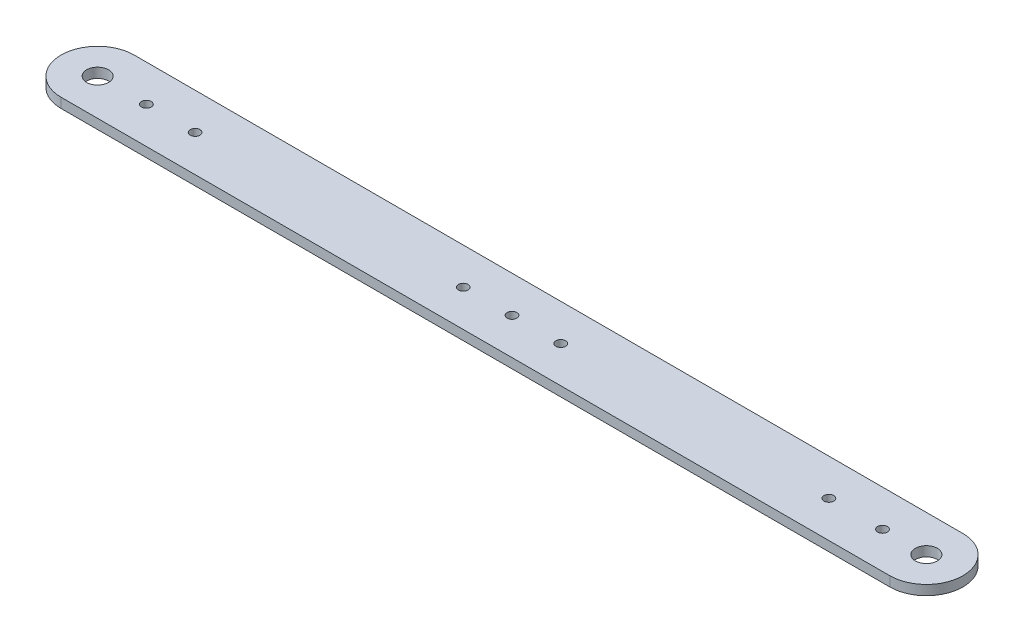
ISO-10303-21;
HEADER;
FILE_DESCRIPTION(('STEP AP214'),'2;1');
FILE_NAME('part.step','',(''),(''),'','','');
FILE_SCHEMA(('AUTOMOTIVE_DESIGN { 1 0 10303 214 1 1 1 1 }'));
ENDSEC;
DATA;
#1=APPLICATION_CONTEXT('core data for automotive mechanical design processes');
#2=APPLICATION_PROTOCOL_DEFINITION('international standard','automotive_design',2000,#1);
#3=PRODUCT_CONTEXT('',#1,'mechanical');
#4=PRODUCT('Part','Part','',(#3));
#5=PRODUCT_RELATED_PRODUCT_CATEGORY('part','',(#4));
#6=PRODUCT_DEFINITION_FORMATION('','',#4);
#7=PRODUCT_DEFINITION_CONTEXT('part definition',#1,'design');
#8=PRODUCT_DEFINITION('design','',#6,#7);
#9=PRODUCT_DEFINITION_SHAPE('','',#8);
#10=(LENGTH_UNIT() NAMED_UNIT(*) SI_UNIT(.MILLI.,.METRE.));
#11=(NAMED_UNIT(*) PLANE_ANGLE_UNIT() SI_UNIT($,.RADIAN.));
#12=(NAMED_UNIT(*) SI_UNIT($,.STERADIAN.) SOLID_ANGLE_UNIT());
#13=UNCERTAINTY_MEASURE_WITH_UNIT(LENGTH_MEASURE(1.E-05),#10,'distance_accuracy_value','');
#14=(GEOMETRIC_REPRESENTATION_CONTEXT(3) GLOBAL_UNCERTAINTY_ASSIGNED_CONTEXT((#13)) GLOBAL_UNIT_ASSIGNED_CONTEXT((#10,
#11,#12)) REPRESENTATION_CONTEXT('',''));
#15=CARTESIAN_POINT('',(0.,0.,0.));
#16=DIRECTION('',(0.,0.,1.));
#17=DIRECTION('',(1.,0.,0.));
#18=AXIS2_PLACEMENT_3D('',#15,#16,#17);
#19=CARTESIAN_POINT('',(-170.,4.,0.));
#20=DIRECTION('',(0.,-1.,0.));
#21=DIRECTION('',(0.,0.,-1.));
#22=AXIS2_PLACEMENT_3D('',#19,#20,#21);
#23=PLANE('',#22);
#24=CARTESIAN_POINT('',(-170.,4.,0.));
#25=DIRECTION('',(0.,1.,0.));
#26=DIRECTION('',(0.,0.,-1.));
#27=AXIS2_PLACEMENT_3D('',#24,#25,#26);
#28=CIRCLE('',#27,15.);
#29=CARTESIAN_POINT('',(-170.,4.,-15.));
#30=VERTEX_POINT('',#29);
#31=CARTESIAN_POINT('',(-170.,4.,15.0000000000001));
#32=VERTEX_POINT('',#31);
#33=EDGE_CURVE('E84',#30,#32,#28,.T.);
#34=ORIENTED_EDGE('',*,*,#33,.T.);
#35=DIRECTION('',(1.,0.,0.));
#36=VECTOR('',#35,1.);
#37=CARTESIAN_POINT('',(170.,4.,15.));
#38=LINE('',#37,#36);
#39=CARTESIAN_POINT('',(170.,4.,15.));
#40=VERTEX_POINT('',#39);
#41=EDGE_CURVE('E79',#32,#40,#38,.T.);
#42=ORIENTED_EDGE('',*,*,#41,.T.);
#43=CARTESIAN_POINT('',(170.,4.,0.));
#44=DIRECTION('',(0.,1.,0.));
#45=DIRECTION('',(0.,0.,-1.));
#46=AXIS2_PLACEMENT_3D('',#43,#44,#45);
#47=CIRCLE('',#46,15.);
#48=CARTESIAN_POINT('',(170.,4.,-15.));
#49=VERTEX_POINT('',#48);
#50=EDGE_CURVE('E82',#40,#49,#47,.T.);
#51=ORIENTED_EDGE('',*,*,#50,.T.);
#52=DIRECTION('',(-1.,0.,0.));
#53=VECTOR('',#52,1.);
#54=CARTESIAN_POINT('',(-170.,4.,-15.));
#55=LINE('',#54,#53);
#56=EDGE_CURVE('E49',#49,#30,#55,.T.);
#57=ORIENTED_EDGE('',*,*,#56,.T.);
#58=EDGE_LOOP('',(#34,#42,#51,#57));
#59=FACE_BOUND('',#58,.T.);
#60=CARTESIAN_POINT('',(-170.,4.,0.));
#61=DIRECTION('',(0.,1.,0.));
#62=DIRECTION('',(0.,0.,1.));
#63=AXIS2_PLACEMENT_3D('',#60,#61,#62);
#64=CIRCLE('',#63,4.50000000000002);
#65=CARTESIAN_POINT('',(-170.,4.,4.50000000000004));
#66=VERTEX_POINT('',#65);
#67=EDGE_CURVE('E99',#66,#66,#64,.T.);
#68=ORIENTED_EDGE('',*,*,#67,.F.);
#69=EDGE_LOOP('',(#68));
#70=FACE_BOUND('',#69,.T.);
#71=CARTESIAN_POINT('',(152.,4.,0.));
#72=DIRECTION('',(0.,1.,0.));
#73=DIRECTION('',(0.,0.,1.));
#74=AXIS2_PLACEMENT_3D('',#71,#72,#73);
#75=CIRCLE('',#74,2.);
#76=CARTESIAN_POINT('',(152.,4.,2.));
#77=VERTEX_POINT('',#76);
#78=EDGE_CURVE('E114',#77,#77,#75,.T.);
#79=ORIENTED_EDGE('',*,*,#78,.F.);
#80=EDGE_LOOP('',(#79));
#81=FACE_BOUND('',#80,.T.);
#82=CARTESIAN_POINT('',(170.,4.,0.));
#83=DIRECTION('',(0.,1.,0.));
#84=DIRECTION('',(0.,0.,1.));
#85=AXIS2_PLACEMENT_3D('',#82,#83,#84);
#86=CIRCLE('',#85,4.49999999999999);
#87=CARTESIAN_POINT('',(170.,4.,4.49999999999999));
#88=VERTEX_POINT('',#87);
#89=EDGE_CURVE('E120',#88,#88,#86,.T.);
#90=ORIENTED_EDGE('',*,*,#89,.F.);
#91=EDGE_LOOP('',(#90));
#92=FACE_BOUND('',#91,.T.);
#93=CARTESIAN_POINT('',(0.,4.,0.));
#94=DIRECTION('',(0.,1.,0.));
#95=DIRECTION('',(0.,0.,1.));
#96=AXIS2_PLACEMENT_3D('',#93,#94,#95);
#97=CIRCLE('',#96,2.);
#98=CARTESIAN_POINT('',(0.,4.,2.));
#99=VERTEX_POINT('',#98);
#100=EDGE_CURVE('E126',#99,#99,#97,.T.);
#101=ORIENTED_EDGE('',*,*,#100,.F.);
#102=EDGE_LOOP('',(#101));
#103=FACE_BOUND('',#102,.T.);
#104=CARTESIAN_POINT('',(-150.,4.,0.));
#105=DIRECTION('',(0.,1.,0.));
#106=DIRECTION('',(0.,0.,1.));
#107=AXIS2_PLACEMENT_3D('',#104,#105,#106);
#108=CIRCLE('',#107,2.);
#109=CARTESIAN_POINT('',(-150.,4.,2.00000000000001));
#110=VERTEX_POINT('',#109);
#111=EDGE_CURVE('E132',#110,#110,#108,.T.);
#112=ORIENTED_EDGE('',*,*,#111,.F.);
#113=EDGE_LOOP('',(#112));
#114=FACE_BOUND('',#113,.T.);
#115=CARTESIAN_POINT('',(-130.,4.,0.));
#116=DIRECTION('',(0.,1.,0.));
#117=DIRECTION('',(0.,0.,1.));
#118=AXIS2_PLACEMENT_3D('',#115,#116,#117);
#119=CIRCLE('',#118,2.);
#120=CARTESIAN_POINT('',(-130.,4.,2.00000000000001));
#121=VERTEX_POINT('',#120);
#122=EDGE_CURVE('E138',#121,#121,#119,.T.);
#123=ORIENTED_EDGE('',*,*,#122,.F.);
#124=EDGE_LOOP('',(#123));
#125=FACE_BOUND('',#124,.T.);
#126=CARTESIAN_POINT('',(-20.,4.,0.));
#127=DIRECTION('',(0.,1.,0.));
#128=DIRECTION('',(0.,0.,1.));
#129=AXIS2_PLACEMENT_3D('',#126,#127,#128);
#130=CIRCLE('',#129,2.);
#131=CARTESIAN_POINT('',(-20.,4.,2.));
#132=VERTEX_POINT('',#131);
#133=EDGE_CURVE('E144',#132,#132,#130,.T.);
#134=ORIENTED_EDGE('',*,*,#133,.F.);
#135=EDGE_LOOP('',(#134));
#136=FACE_BOUND('',#135,.T.);
#137=CARTESIAN_POINT('',(20.,4.,0.));
#138=DIRECTION('',(0.,1.,0.));
#139=DIRECTION('',(0.,0.,-1.));
#140=AXIS2_PLACEMENT_3D('',#137,#138,#139);
#141=CIRCLE('',#140,2.);
#142=CARTESIAN_POINT('',(20.,4.,-2.));
#143=VERTEX_POINT('',#142);
#144=EDGE_CURVE('E150',#143,#143,#141,.T.);
#145=ORIENTED_EDGE('',*,*,#144,.F.);
#146=EDGE_LOOP('',(#145));
#147=FACE_BOUND('',#146,.T.);
#148=CARTESIAN_POINT('',(130.,4.,0.));
#149=DIRECTION('',(0.,1.,0.));
#150=DIRECTION('',(0.,0.,-1.));
#151=AXIS2_PLACEMENT_3D('',#148,#149,#150);
#152=CIRCLE('',#151,2.);
#153=CARTESIAN_POINT('',(130.,4.,-1.99999999999998));
#154=VERTEX_POINT('',#153);
#155=EDGE_CURVE('E156',#154,#154,#152,.T.);
#156=ORIENTED_EDGE('',*,*,#155,.F.);
#157=EDGE_LOOP('',(#156));
#158=FACE_BOUND('',#157,.T.);
#159=ADVANCED_FACE('F32',(#59,#70,#81,#92,#103,#114,#125,#136,#147,#158),#23,.F.);
#160=CARTESIAN_POINT('',(-170.,0.,0.));
#161=DIRECTION('',(0.,-1.,0.));
#162=DIRECTION('',(0.,0.,-1.));
#163=AXIS2_PLACEMENT_3D('',#160,#161,#162);
#164=PLANE('',#163);
#165=CARTESIAN_POINT('',(20.,0.,0.));
#166=DIRECTION('',(0.,1.,0.));
#167=DIRECTION('',(0.,0.,-1.));
#168=AXIS2_PLACEMENT_3D('',#165,#166,#167);
#169=CIRCLE('',#168,2.);
#170=CARTESIAN_POINT('',(20.,0.,-2.));
#171=VERTEX_POINT('',#170);
#172=EDGE_CURVE('E153',#171,#171,#169,.T.);
#173=ORIENTED_EDGE('',*,*,#172,.T.);
#174=EDGE_LOOP('',(#173));
#175=FACE_BOUND('',#174,.T.);
#176=CARTESIAN_POINT('',(-130.,0.,0.));
#177=DIRECTION('',(0.,1.,0.));
#178=DIRECTION('',(0.,0.,1.));
#179=AXIS2_PLACEMENT_3D('',#176,#177,#178);
#180=CIRCLE('',#179,2.);
#181=CARTESIAN_POINT('',(-130.,0.,2.00000000000001));
#182=VERTEX_POINT('',#181);
#183=EDGE_CURVE('E141',#182,#182,#180,.T.);
#184=ORIENTED_EDGE('',*,*,#183,.T.);
#185=EDGE_LOOP('',(#184));
#186=FACE_BOUND('',#185,.T.);
#187=CARTESIAN_POINT('',(0.,0.,0.));
#188=DIRECTION('',(0.,1.,0.));
#189=DIRECTION('',(0.,0.,1.));
#190=AXIS2_PLACEMENT_3D('',#187,#188,#189);
#191=CIRCLE('',#190,2.);
#192=CARTESIAN_POINT('',(0.,0.,2.));
#193=VERTEX_POINT('',#192);
#194=EDGE_CURVE('E129',#193,#193,#191,.T.);
#195=ORIENTED_EDGE('',*,*,#194,.T.);
#196=EDGE_LOOP('',(#195));
#197=FACE_BOUND('',#196,.T.);
#198=CARTESIAN_POINT('',(152.,0.,0.));
#199=DIRECTION('',(0.,1.,0.));
#200=DIRECTION('',(0.,0.,1.));
#201=AXIS2_PLACEMENT_3D('',#198,#199,#200);
#202=CIRCLE('',#201,2.);
#203=CARTESIAN_POINT('',(152.,0.,2.));
#204=VERTEX_POINT('',#203);
#205=EDGE_CURVE('E117',#204,#204,#202,.T.);
#206=ORIENTED_EDGE('',*,*,#205,.T.);
#207=EDGE_LOOP('',(#206));
#208=FACE_BOUND('',#207,.T.);
#209=CARTESIAN_POINT('',(-170.,0.,0.));
#210=DIRECTION('',(0.,1.,0.));
#211=DIRECTION('',(0.,0.,-1.));
#212=AXIS2_PLACEMENT_3D('',#209,#210,#211);
#213=CIRCLE('',#212,15.);
#214=CARTESIAN_POINT('',(-170.,0.,-15.));
#215=VERTEX_POINT('',#214);
#216=CARTESIAN_POINT('',(-170.,0.,15.0000000000001));
#217=VERTEX_POINT('',#216);
#218=EDGE_CURVE('E96',#215,#217,#213,.T.);
#219=ORIENTED_EDGE('',*,*,#218,.F.);
#220=DIRECTION('',(-1.,0.,0.));
#221=VECTOR('',#220,1.);
#222=CARTESIAN_POINT('',(-170.,0.,-15.));
#223=LINE('',#222,#221);
#224=CARTESIAN_POINT('',(170.,0.,-15.));
#225=VERTEX_POINT('',#224);
#226=EDGE_CURVE('E72',#225,#215,#223,.T.);
#227=ORIENTED_EDGE('',*,*,#226,.F.);
#228=CARTESIAN_POINT('',(170.,0.,0.));
#229=DIRECTION('',(0.,1.,0.));
#230=DIRECTION('',(0.,0.,-1.));
#231=AXIS2_PLACEMENT_3D('',#228,#229,#230);
#232=CIRCLE('',#231,15.);
#233=CARTESIAN_POINT('',(170.,0.,15.));
#234=VERTEX_POINT('',#233);
#235=EDGE_CURVE('E66',#234,#225,#232,.T.);
#236=ORIENTED_EDGE('',*,*,#235,.F.);
#237=DIRECTION('',(1.,0.,0.));
#238=VECTOR('',#237,1.);
#239=CARTESIAN_POINT('',(170.,0.,15.));
#240=LINE('',#239,#238);
#241=EDGE_CURVE('E88',#217,#234,#240,.T.);
#242=ORIENTED_EDGE('',*,*,#241,.F.);
#243=EDGE_LOOP('',(#219,#227,#236,#242));
#244=FACE_BOUND('',#243,.T.);
#245=CARTESIAN_POINT('',(-170.,0.,0.));
#246=DIRECTION('',(0.,1.,0.));
#247=DIRECTION('',(0.,0.,1.));
#248=AXIS2_PLACEMENT_3D('',#245,#246,#247);
#249=CIRCLE('',#248,4.50000000000002);
#250=CARTESIAN_POINT('',(-170.,0.,4.50000000000004));
#251=VERTEX_POINT('',#250);
#252=EDGE_CURVE('E111',#251,#251,#249,.T.);
#253=ORIENTED_EDGE('',*,*,#252,.T.);
#254=EDGE_LOOP('',(#253));
#255=FACE_BOUND('',#254,.T.);
#256=CARTESIAN_POINT('',(170.,0.,0.));
#257=DIRECTION('',(0.,1.,0.));
#258=DIRECTION('',(0.,0.,1.));
#259=AXIS2_PLACEMENT_3D('',#256,#257,#258);
#260=CIRCLE('',#259,4.49999999999999);
#261=CARTESIAN_POINT('',(170.,0.,4.49999999999999));
#262=VERTEX_POINT('',#261);
#263=EDGE_CURVE('E123',#262,#262,#260,.T.);
#264=ORIENTED_EDGE('',*,*,#263,.T.);
#265=EDGE_LOOP('',(#264));
#266=FACE_BOUND('',#265,.T.);
#267=CARTESIAN_POINT('',(-150.,0.,0.));
#268=DIRECTION('',(0.,1.,0.));
#269=DIRECTION('',(0.,0.,1.));
#270=AXIS2_PLACEMENT_3D('',#267,#268,#269);
#271=CIRCLE('',#270,2.);
#272=CARTESIAN_POINT('',(-150.,0.,2.00000000000001));
#273=VERTEX_POINT('',#272);
#274=EDGE_CURVE('E135',#273,#273,#271,.T.);
#275=ORIENTED_EDGE('',*,*,#274,.T.);
#276=EDGE_LOOP('',(#275));
#277=FACE_BOUND('',#276,.T.);
#278=CARTESIAN_POINT('',(-20.,0.,0.));
#279=DIRECTION('',(0.,1.,0.));
#280=DIRECTION('',(0.,0.,1.));
#281=AXIS2_PLACEMENT_3D('',#278,#279,#280);
#282=CIRCLE('',#281,2.);
#283=CARTESIAN_POINT('',(-20.,0.,2.));
#284=VERTEX_POINT('',#283);
#285=EDGE_CURVE('E147',#284,#284,#282,.T.);
#286=ORIENTED_EDGE('',*,*,#285,.T.);
#287=EDGE_LOOP('',(#286));
#288=FACE_BOUND('',#287,.T.);
#289=CARTESIAN_POINT('',(130.,0.,0.));
#290=DIRECTION('',(0.,1.,0.));
#291=DIRECTION('',(0.,0.,-1.));
#292=AXIS2_PLACEMENT_3D('',#289,#290,#291);
#293=CIRCLE('',#292,2.);
#294=CARTESIAN_POINT('',(130.,0.,-1.99999999999998));
#295=VERTEX_POINT('',#294);
#296=EDGE_CURVE('E159',#295,#295,#293,.T.);
#297=ORIENTED_EDGE('',*,*,#296,.T.);
#298=EDGE_LOOP('',(#297));
#299=FACE_BOUND('',#298,.T.);
#300=ADVANCED_FACE('F107',(#175,#186,#197,#208,#244,#255,#266,#277,#288,#299),#164,.T.);
#301=CARTESIAN_POINT('',(-170.,4.,0.));
#302=DIRECTION('',(0.,-1.,0.));
#303=DIRECTION('',(0.,0.,-1.));
#304=AXIS2_PLACEMENT_3D('',#301,#302,#303);
#305=CYLINDRICAL_SURFACE('',#304,15.);
#306=ORIENTED_EDGE('',*,*,#218,.T.);
#307=DIRECTION('',(0.,-1.,0.));
#308=VECTOR('',#307,1.);
#309=CARTESIAN_POINT('',(-170.,4.,15.0000000000001));
#310=LINE('',#309,#308);
#311=EDGE_CURVE('E11',#32,#217,#310,.T.);
#312=ORIENTED_EDGE('',*,*,#311,.F.);
#313=ORIENTED_EDGE('',*,*,#33,.F.);
#314=DIRECTION('',(0.,-1.,0.));
#315=VECTOR('',#314,1.);
#316=CARTESIAN_POINT('',(-170.,4.,-15.));
#317=LINE('',#316,#315);
#318=EDGE_CURVE('E92',#30,#215,#317,.T.);
#319=ORIENTED_EDGE('',*,*,#318,.T.);
#320=EDGE_LOOP('',(#306,#312,#313,#319));
#321=FACE_BOUND('',#320,.T.);
#322=ADVANCED_FACE('F34',(#321),#305,.T.);
#323=CARTESIAN_POINT('',(170.,4.,15.));
#324=DIRECTION('',(0.,0.,-1.));
#325=DIRECTION('',(-1.,0.,0.));
#326=AXIS2_PLACEMENT_3D('',#323,#324,#325);
#327=PLANE('',#326);
#328=ORIENTED_EDGE('',*,*,#241,.T.);
#329=DIRECTION('',(0.,-1.,0.));
#330=VECTOR('',#329,1.);
#331=CARTESIAN_POINT('',(170.,4.,15.));
#332=LINE('',#331,#330);
#333=EDGE_CURVE('E41',#40,#234,#332,.T.);
#334=ORIENTED_EDGE('',*,*,#333,.F.);
#335=ORIENTED_EDGE('',*,*,#41,.F.);
#336=ORIENTED_EDGE('',*,*,#311,.T.);
#337=EDGE_LOOP('',(#328,#334,#335,#336));
#338=FACE_BOUND('',#337,.T.);
#339=ADVANCED_FACE('F87',(#338),#327,.F.);
#340=CARTESIAN_POINT('',(170.,4.,0.));
#341=DIRECTION('',(0.,-1.,0.));
#342=DIRECTION('',(0.,0.,-1.));
#343=AXIS2_PLACEMENT_3D('',#340,#341,#342);
#344=CYLINDRICAL_SURFACE('',#343,15.);
#345=ORIENTED_EDGE('',*,*,#235,.T.);
#346=DIRECTION('',(0.,-1.,0.));
#347=VECTOR('',#346,1.);
#348=CARTESIAN_POINT('',(170.,4.,-15.));
#349=LINE('',#348,#347);
#350=EDGE_CURVE('E89',#49,#225,#349,.T.);
#351=ORIENTED_EDGE('',*,*,#350,.F.);
#352=ORIENTED_EDGE('',*,*,#50,.F.);
#353=ORIENTED_EDGE('',*,*,#333,.T.);
#354=EDGE_LOOP('',(#345,#351,#352,#353));
#355=FACE_BOUND('',#354,.T.);
#356=ADVANCED_FACE('F90',(#355),#344,.T.);
#357=CARTESIAN_POINT('',(-170.,4.,-15.));
#358=DIRECTION('',(0.,0.,1.));
#359=DIRECTION('',(1.,0.,0.));
#360=AXIS2_PLACEMENT_3D('',#357,#358,#359);
#361=PLANE('',#360);
#362=ORIENTED_EDGE('',*,*,#226,.T.);
#363=ORIENTED_EDGE('',*,*,#318,.F.);
#364=ORIENTED_EDGE('',*,*,#56,.F.);
#365=ORIENTED_EDGE('',*,*,#350,.T.);
#366=EDGE_LOOP('',(#362,#363,#364,#365));
#367=FACE_BOUND('',#366,.T.);
#368=ADVANCED_FACE('F104',(#367),#361,.F.);
#369=CARTESIAN_POINT('',(-170.,4.,0.));
#370=DIRECTION('',(0.,-1.,0.));
#371=DIRECTION('',(0.,0.,-1.));
#372=AXIS2_PLACEMENT_3D('',#369,#370,#371);
#373=CYLINDRICAL_SURFACE('',#372,4.50000000000002);
#374=ORIENTED_EDGE('',*,*,#67,.T.);
#375=EDGE_LOOP('',(#374));
#376=FACE_BOUND('',#375,.T.);
#377=ORIENTED_EDGE('',*,*,#252,.F.);
#378=EDGE_LOOP('',(#377));
#379=FACE_BOUND('',#378,.T.);
#380=ADVANCED_FACE('F176',(#376,#379),#373,.F.);
#381=CARTESIAN_POINT('',(152.,4.,0.));
#382=DIRECTION('',(0.,-1.,0.));
#383=DIRECTION('',(0.,0.,-1.));
#384=AXIS2_PLACEMENT_3D('',#381,#382,#383);
#385=CYLINDRICAL_SURFACE('',#384,2.);
#386=ORIENTED_EDGE('',*,*,#78,.T.);
#387=EDGE_LOOP('',(#386));
#388=FACE_BOUND('',#387,.T.);
#389=ORIENTED_EDGE('',*,*,#205,.F.);
#390=EDGE_LOOP('',(#389));
#391=FACE_BOUND('',#390,.T.);
#392=ADVANCED_FACE('F222',(#388,#391),#385,.F.);
#393=CARTESIAN_POINT('',(170.,4.,0.));
#394=DIRECTION('',(0.,-1.,0.));
#395=DIRECTION('',(0.,0.,-1.));
#396=AXIS2_PLACEMENT_3D('',#393,#394,#395);
#397=CYLINDRICAL_SURFACE('',#396,4.49999999999999);
#398=ORIENTED_EDGE('',*,*,#89,.T.);
#399=EDGE_LOOP('',(#398));
#400=FACE_BOUND('',#399,.T.);
#401=ORIENTED_EDGE('',*,*,#263,.F.);
#402=EDGE_LOOP('',(#401));
#403=FACE_BOUND('',#402,.T.);
#404=ADVANCED_FACE('F230',(#400,#403),#397,.F.);
#405=CARTESIAN_POINT('',(0.,4.,0.));
#406=DIRECTION('',(0.,-1.,0.));
#407=DIRECTION('',(0.,0.,-1.));
#408=AXIS2_PLACEMENT_3D('',#405,#406,#407);
#409=CYLINDRICAL_SURFACE('',#408,2.);
#410=ORIENTED_EDGE('',*,*,#100,.T.);
#411=EDGE_LOOP('',(#410));
#412=FACE_BOUND('',#411,.T.);
#413=ORIENTED_EDGE('',*,*,#194,.F.);
#414=EDGE_LOOP('',(#413));
#415=FACE_BOUND('',#414,.T.);
#416=ADVANCED_FACE('F238',(#412,#415),#409,.F.);
#417=CARTESIAN_POINT('',(-150.,4.,0.));
#418=DIRECTION('',(0.,-1.,0.));
#419=DIRECTION('',(0.,0.,-1.));
#420=AXIS2_PLACEMENT_3D('',#417,#418,#419);
#421=CYLINDRICAL_SURFACE('',#420,2.);
#422=ORIENTED_EDGE('',*,*,#111,.T.);
#423=EDGE_LOOP('',(#422));
#424=FACE_BOUND('',#423,.T.);
#425=ORIENTED_EDGE('',*,*,#274,.F.);
#426=EDGE_LOOP('',(#425));
#427=FACE_BOUND('',#426,.T.);
#428=ADVANCED_FACE('F247',(#424,#427),#421,.F.);
#429=CARTESIAN_POINT('',(-130.,4.,0.));
#430=DIRECTION('',(0.,-1.,0.));
#431=DIRECTION('',(0.,0.,-1.));
#432=AXIS2_PLACEMENT_3D('',#429,#430,#431);
#433=CYLINDRICAL_SURFACE('',#432,2.);
#434=ORIENTED_EDGE('',*,*,#122,.T.);
#435=EDGE_LOOP('',(#434));
#436=FACE_BOUND('',#435,.T.);
#437=ORIENTED_EDGE('',*,*,#183,.F.);
#438=EDGE_LOOP('',(#437));
#439=FACE_BOUND('',#438,.T.);
#440=ADVANCED_FACE('F256',(#436,#439),#433,.F.);
#441=CARTESIAN_POINT('',(-20.,4.,0.));
#442=DIRECTION('',(0.,-1.,0.));
#443=DIRECTION('',(0.,0.,-1.));
#444=AXIS2_PLACEMENT_3D('',#441,#442,#443);
#445=CYLINDRICAL_SURFACE('',#444,2.);
#446=ORIENTED_EDGE('',*,*,#133,.T.);
#447=EDGE_LOOP('',(#446));
#448=FACE_BOUND('',#447,.T.);
#449=ORIENTED_EDGE('',*,*,#285,.F.);
#450=EDGE_LOOP('',(#449));
#451=FACE_BOUND('',#450,.T.);
#452=ADVANCED_FACE('F265',(#448,#451),#445,.F.);
#453=CARTESIAN_POINT('',(20.,4.,0.));
#454=DIRECTION('',(0.,-1.,0.));
#455=DIRECTION('',(0.,0.,-1.));
#456=AXIS2_PLACEMENT_3D('',#453,#454,#455);
#457=CYLINDRICAL_SURFACE('',#456,2.);
#458=ORIENTED_EDGE('',*,*,#144,.T.);
#459=EDGE_LOOP('',(#458));
#460=FACE_BOUND('',#459,.T.);
#461=ORIENTED_EDGE('',*,*,#172,.F.);
#462=EDGE_LOOP('',(#461));
#463=FACE_BOUND('',#462,.T.);
#464=ADVANCED_FACE('F274',(#460,#463),#457,.F.);
#465=CARTESIAN_POINT('',(130.,4.,0.));
#466=DIRECTION('',(0.,-1.,0.));
#467=DIRECTION('',(0.,0.,-1.));
#468=AXIS2_PLACEMENT_3D('',#465,#466,#467);
#469=CYLINDRICAL_SURFACE('',#468,2.);
#470=ORIENTED_EDGE('',*,*,#155,.T.);
#471=EDGE_LOOP('',(#470));
#472=FACE_BOUND('',#471,.T.);
#473=ORIENTED_EDGE('',*,*,#296,.F.);
#474=EDGE_LOOP('',(#473));
#475=FACE_BOUND('',#474,.T.);
#476=ADVANCED_FACE('F165',(#472,#475),#469,.F.);
#477=CLOSED_SHELL('',(#159,#300,#322,#339,#356,#368,#380,#392,#404,#416,#428,#440,#452,#464,#476));
#478=MANIFOLD_SOLID_BREP('B2',#477);
#479=ADVANCED_BREP_SHAPE_REPRESENTATION('',(#18,#478),#14);
#480=SHAPE_DEFINITION_REPRESENTATION(#9,#479);
ENDSEC;
END-ISO-10303-21;
